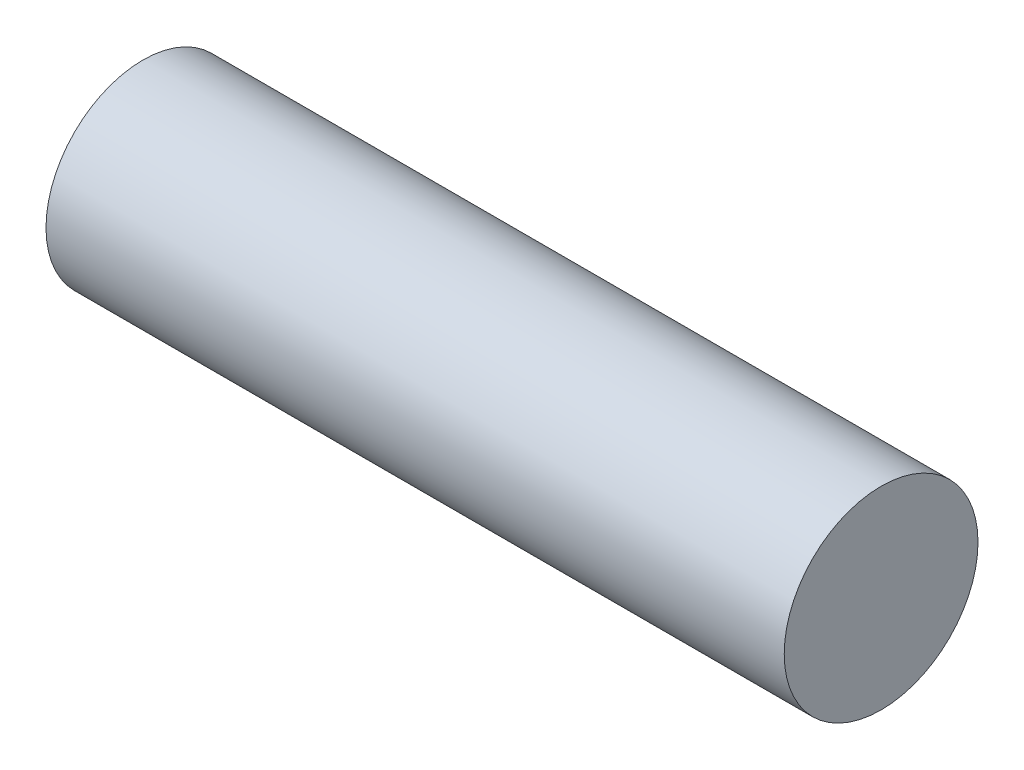
ISO-10303-21;
HEADER;
FILE_DESCRIPTION(('STEP AP214'),'2;1');
FILE_NAME('part.step','',(''),(''),'','','');
FILE_SCHEMA(('AUTOMOTIVE_DESIGN { 1 0 10303 214 1 1 1 1 }'));
ENDSEC;
DATA;
#1=APPLICATION_CONTEXT('core data for automotive mechanical design processes');
#2=APPLICATION_PROTOCOL_DEFINITION('international standard','automotive_design',2000,#1);
#3=PRODUCT_CONTEXT('',#1,'mechanical');
#4=PRODUCT('Part','Part','',(#3));
#5=PRODUCT_RELATED_PRODUCT_CATEGORY('part','',(#4));
#6=PRODUCT_DEFINITION_FORMATION('','',#4);
#7=PRODUCT_DEFINITION_CONTEXT('part definition',#1,'design');
#8=PRODUCT_DEFINITION('design','',#6,#7);
#9=PRODUCT_DEFINITION_SHAPE('','',#8);
#10=(LENGTH_UNIT() NAMED_UNIT(*) SI_UNIT(.MILLI.,.METRE.));
#11=(NAMED_UNIT(*) PLANE_ANGLE_UNIT() SI_UNIT($,.RADIAN.));
#12=(NAMED_UNIT(*) SI_UNIT($,.STERADIAN.) SOLID_ANGLE_UNIT());
#13=UNCERTAINTY_MEASURE_WITH_UNIT(LENGTH_MEASURE(1.E-05),#10,'distance_accuracy_value','');
#14=(GEOMETRIC_REPRESENTATION_CONTEXT(3) GLOBAL_UNCERTAINTY_ASSIGNED_CONTEXT((#13)) GLOBAL_UNIT_ASSIGNED_CONTEXT((#10,
#11,#12)) REPRESENTATION_CONTEXT('',''));
#15=CARTESIAN_POINT('',(0.,0.,0.));
#16=DIRECTION('',(0.,0.,1.));
#17=DIRECTION('',(1.,0.,0.));
#18=AXIS2_PLACEMENT_3D('',#15,#16,#17);
#19=CARTESIAN_POINT('',(40.,0.,0.));
#20=DIRECTION('',(-1.,0.,0.));
#21=DIRECTION('',(0.,0.,1.));
#22=AXIS2_PLACEMENT_3D('',#19,#20,#21);
#23=CYLINDRICAL_SURFACE('',#22,10.5);
#24=CARTESIAN_POINT('',(40.,0.,0.));
#25=DIRECTION('',(1.,0.,0.));
#26=DIRECTION('',(0.,0.,-1.));
#27=AXIS2_PLACEMENT_3D('',#24,#25,#26);
#28=CIRCLE('',#27,10.5);
#29=CARTESIAN_POINT('',(40.,0.,-10.5));
#30=VERTEX_POINT('',#29);
#31=EDGE_CURVE('E10',#30,#30,#28,.T.);
#32=ORIENTED_EDGE('',*,*,#31,.F.);
#33=EDGE_LOOP('',(#32));
#34=FACE_BOUND('',#33,.T.);
#35=CARTESIAN_POINT('',(-40.,0.,0.));
#36=DIRECTION('',(1.,0.,0.));
#37=DIRECTION('',(0.,0.,-1.));
#38=AXIS2_PLACEMENT_3D('',#35,#36,#37);
#39=CIRCLE('',#38,10.5);
#40=CARTESIAN_POINT('',(-40.,0.,-10.5));
#41=VERTEX_POINT('',#40);
#42=EDGE_CURVE('E34',#41,#41,#39,.T.);
#43=ORIENTED_EDGE('',*,*,#42,.T.);
#44=EDGE_LOOP('',(#43));
#45=FACE_BOUND('',#44,.T.);
#46=ADVANCED_FACE('F31',(#34,#45),#23,.T.);
#47=CARTESIAN_POINT('',(40.,0.,0.));
#48=DIRECTION('',(1.,0.,0.));
#49=DIRECTION('',(0.,0.,-1.));
#50=AXIS2_PLACEMENT_3D('',#47,#48,#49);
#51=PLANE('',#50);
#52=ORIENTED_EDGE('',*,*,#31,.T.);
#53=EDGE_LOOP('',(#52));
#54=FACE_BOUND('',#53,.T.);
#55=ADVANCED_FACE('F46',(#54),#51,.T.);
#56=CARTESIAN_POINT('',(-40.,0.,0.));
#57=DIRECTION('',(1.,0.,0.));
#58=DIRECTION('',(0.,0.,-1.));
#59=AXIS2_PLACEMENT_3D('',#56,#57,#58);
#60=PLANE('',#59);
#61=ORIENTED_EDGE('',*,*,#42,.F.);
#62=EDGE_LOOP('',(#61));
#63=FACE_BOUND('',#62,.T.);
#64=ADVANCED_FACE('F44',(#63),#60,.F.);
#65=CLOSED_SHELL('',(#46,#55,#64));
#66=MANIFOLD_SOLID_BREP('B2',#65);
#67=ADVANCED_BREP_SHAPE_REPRESENTATION('',(#18,#66),#14);
#68=SHAPE_DEFINITION_REPRESENTATION(#9,#67);
ENDSEC;
END-ISO-10303-21;
